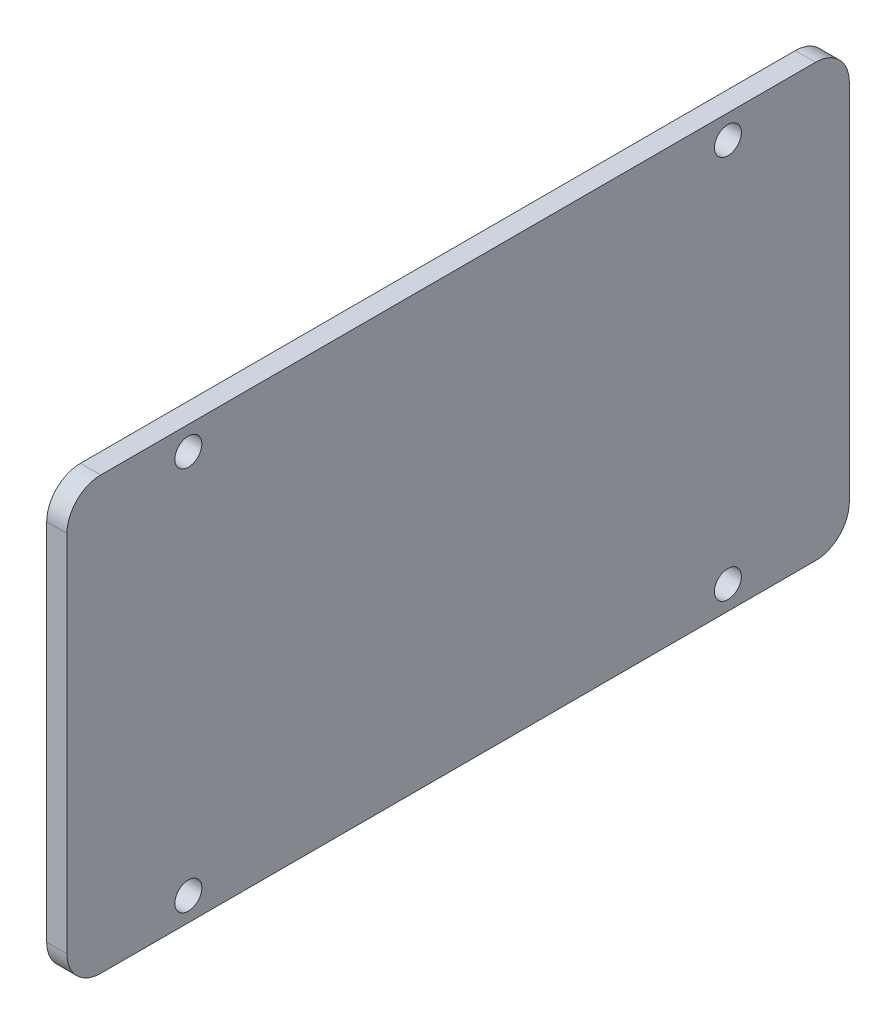
ISO-10303-21;
HEADER;
FILE_DESCRIPTION(('STEP AP214'),'2;1');
FILE_NAME('part.step','',(''),(''),'','','');
FILE_SCHEMA(('AUTOMOTIVE_DESIGN { 1 0 10303 214 1 1 1 1 }'));
ENDSEC;
DATA;
#1=APPLICATION_CONTEXT('core data for automotive mechanical design processes');
#2=APPLICATION_PROTOCOL_DEFINITION('international standard','automotive_design',2000,#1);
#3=PRODUCT_CONTEXT('',#1,'mechanical');
#4=PRODUCT('Part','Part','',(#3));
#5=PRODUCT_RELATED_PRODUCT_CATEGORY('part','',(#4));
#6=PRODUCT_DEFINITION_FORMATION('','',#4);
#7=PRODUCT_DEFINITION_CONTEXT('part definition',#1,'design');
#8=PRODUCT_DEFINITION('design','',#6,#7);
#9=PRODUCT_DEFINITION_SHAPE('','',#8);
#10=(LENGTH_UNIT() NAMED_UNIT(*) SI_UNIT(.MILLI.,.METRE.));
#11=(NAMED_UNIT(*) PLANE_ANGLE_UNIT() SI_UNIT($,.RADIAN.));
#12=(NAMED_UNIT(*) SI_UNIT($,.STERADIAN.) SOLID_ANGLE_UNIT());
#13=UNCERTAINTY_MEASURE_WITH_UNIT(LENGTH_MEASURE(1.E-05),#10,'distance_accuracy_value','');
#14=(GEOMETRIC_REPRESENTATION_CONTEXT(3) GLOBAL_UNCERTAINTY_ASSIGNED_CONTEXT((#13)) GLOBAL_UNIT_ASSIGNED_CONTEXT((#10,
#11,#12)) REPRESENTATION_CONTEXT('',''));
#15=CARTESIAN_POINT('',(0.,0.,0.));
#16=DIRECTION('',(0.,0.,1.));
#17=DIRECTION('',(1.,0.,0.));
#18=AXIS2_PLACEMENT_3D('',#15,#16,#17);
#19=CARTESIAN_POINT('',(3.,0.,116.));
#20=DIRECTION('',(-1.,0.,0.));
#21=DIRECTION('',(0.,0.,1.));
#22=AXIS2_PLACEMENT_3D('',#19,#20,#21);
#23=PLANE('',#22);
#24=CARTESIAN_POINT('',(3.,3.5,18.));
#25=DIRECTION('',(-1.,0.,0.));
#26=DIRECTION('',(0.,0.,1.));
#27=AXIS2_PLACEMENT_3D('',#24,#25,#26);
#28=CIRCLE('',#27,2.);
#29=CARTESIAN_POINT('',(3.,3.5,20.));
#30=VERTEX_POINT('',#29);
#31=EDGE_CURVE('E232',#30,#30,#28,.T.);
#32=ORIENTED_EDGE('',*,*,#31,.T.);
#33=EDGE_LOOP('',(#32));
#34=FACE_BOUND('',#33,.T.);
#35=CARTESIAN_POINT('',(3.,3.5,98.));
#36=DIRECTION('',(-1.,0.,0.));
#37=DIRECTION('',(0.,0.,1.));
#38=AXIS2_PLACEMENT_3D('',#35,#36,#37);
#39=CIRCLE('',#38,2.);
#40=CARTESIAN_POINT('',(3.,3.5,100.));
#41=VERTEX_POINT('',#40);
#42=EDGE_CURVE('E236',#41,#41,#39,.T.);
#43=ORIENTED_EDGE('',*,*,#42,.T.);
#44=EDGE_LOOP('',(#43));
#45=FACE_BOUND('',#44,.T.);
#46=CARTESIAN_POINT('',(3.,60.5,98.));
#47=DIRECTION('',(-1.,0.,0.));
#48=DIRECTION('',(0.,0.,1.));
#49=AXIS2_PLACEMENT_3D('',#46,#47,#48);
#50=CIRCLE('',#49,2.);
#51=CARTESIAN_POINT('',(3.,60.5,100.));
#52=VERTEX_POINT('',#51);
#53=EDGE_CURVE('E245',#52,#52,#50,.T.);
#54=ORIENTED_EDGE('',*,*,#53,.T.);
#55=EDGE_LOOP('',(#54));
#56=FACE_BOUND('',#55,.T.);
#57=CARTESIAN_POINT('',(3.,60.5,18.));
#58=DIRECTION('',(-1.,0.,0.));
#59=DIRECTION('',(0.,0.,1.));
#60=AXIS2_PLACEMENT_3D('',#57,#58,#59);
#61=CIRCLE('',#60,2.);
#62=CARTESIAN_POINT('',(3.,60.5,20.));
#63=VERTEX_POINT('',#62);
#64=EDGE_CURVE('E170',#63,#63,#61,.T.);
#65=ORIENTED_EDGE('',*,*,#64,.T.);
#66=EDGE_LOOP('',(#65));
#67=FACE_BOUND('',#66,.T.);
#68=DIRECTION('',(0.,1.,0.));
#69=VECTOR('',#68,1.);
#70=CARTESIAN_POINT('',(3.,0.,116.));
#71=LINE('',#70,#69);
#72=CARTESIAN_POINT('',(3.,5.,116.));
#73=VERTEX_POINT('',#72);
#74=CARTESIAN_POINT('',(3.,59.,116.));
#75=VERTEX_POINT('',#74);
#76=EDGE_CURVE('E105',#73,#75,#71,.T.);
#77=ORIENTED_EDGE('',*,*,#76,.F.);
#78=CARTESIAN_POINT('',(3.,5.,111.));
#79=DIRECTION('',(-1.,0.,0.));
#80=DIRECTION('',(0.,0.,1.));
#81=AXIS2_PLACEMENT_3D('',#78,#79,#80);
#82=CIRCLE('',#81,5.);
#83=CARTESIAN_POINT('',(3.,0.,111.));
#84=VERTEX_POINT('',#83);
#85=EDGE_CURVE('E100',#73,#84,#82,.F.);
#86=ORIENTED_EDGE('',*,*,#85,.T.);
#87=DIRECTION('',(0.,0.,-1.));
#88=VECTOR('',#87,1.);
#89=CARTESIAN_POINT('',(3.,0.,116.));
#90=LINE('',#89,#88);
#91=CARTESIAN_POINT('',(3.,0.,5.00000000000003));
#92=VERTEX_POINT('',#91);
#93=EDGE_CURVE('E102',#84,#92,#90,.T.);
#94=ORIENTED_EDGE('',*,*,#93,.T.);
#95=CARTESIAN_POINT('',(3.,5.,5.));
#96=DIRECTION('',(-1.,0.,0.));
#97=DIRECTION('',(0.,0.,1.));
#98=AXIS2_PLACEMENT_3D('',#95,#96,#97);
#99=CIRCLE('',#98,5.);
#100=CARTESIAN_POINT('',(3.,5.,0.));
#101=VERTEX_POINT('',#100);
#102=EDGE_CURVE('E110',#92,#101,#99,.F.);
#103=ORIENTED_EDGE('',*,*,#102,.T.);
#104=DIRECTION('',(0.,1.,0.));
#105=VECTOR('',#104,1.);
#106=CARTESIAN_POINT('',(3.,0.,0.));
#107=LINE('',#106,#105);
#108=CARTESIAN_POINT('',(3.,59.,0.));
#109=VERTEX_POINT('',#108);
#110=EDGE_CURVE('E167',#101,#109,#107,.T.);
#111=ORIENTED_EDGE('',*,*,#110,.T.);
#112=CARTESIAN_POINT('',(3.,59.,5.));
#113=DIRECTION('',(-1.,0.,0.));
#114=DIRECTION('',(0.,0.,1.));
#115=AXIS2_PLACEMENT_3D('',#112,#113,#114);
#116=CIRCLE('',#115,5.);
#117=CARTESIAN_POINT('',(3.,64.,5.00000000000003));
#118=VERTEX_POINT('',#117);
#119=EDGE_CURVE('E49',#109,#118,#116,.F.);
#120=ORIENTED_EDGE('',*,*,#119,.T.);
#121=DIRECTION('',(0.,0.,-1.));
#122=VECTOR('',#121,1.);
#123=CARTESIAN_POINT('',(3.,64.,116.));
#124=LINE('',#123,#122);
#125=CARTESIAN_POINT('',(3.,64.,111.));
#126=VERTEX_POINT('',#125);
#127=EDGE_CURVE('E129',#126,#118,#124,.T.);
#128=ORIENTED_EDGE('',*,*,#127,.F.);
#129=CARTESIAN_POINT('',(3.,59.,111.));
#130=DIRECTION('',(-1.,0.,0.));
#131=DIRECTION('',(0.,0.,1.));
#132=AXIS2_PLACEMENT_3D('',#129,#130,#131);
#133=CIRCLE('',#132,5.);
#134=EDGE_CURVE('E57',#126,#75,#133,.F.);
#135=ORIENTED_EDGE('',*,*,#134,.T.);
#136=EDGE_LOOP('',(#77,#86,#94,#103,#111,#120,#128,#135));
#137=FACE_BOUND('',#136,.T.);
#138=ADVANCED_FACE('F34',(#34,#45,#56,#67,#137),#23,.F.);
#139=CARTESIAN_POINT('',(0.,64.,116.));
#140=DIRECTION('',(0.,1.,0.));
#141=DIRECTION('',(0.,0.,1.));
#142=AXIS2_PLACEMENT_3D('',#139,#140,#141);
#143=PLANE('',#142);
#144=DIRECTION('',(0.,0.,-1.));
#145=VECTOR('',#144,1.);
#146=CARTESIAN_POINT('',(0.,64.,116.));
#147=LINE('',#146,#145);
#148=CARTESIAN_POINT('',(0.,64.,111.));
#149=VERTEX_POINT('',#148);
#150=CARTESIAN_POINT('',(0.,64.,5.00000000000003));
#151=VERTEX_POINT('',#150);
#152=EDGE_CURVE('E153',#149,#151,#147,.T.);
#153=ORIENTED_EDGE('',*,*,#152,.F.);
#154=DIRECTION('',(1.,0.,0.));
#155=VECTOR('',#154,1.);
#156=CARTESIAN_POINT('',(3.,64.,111.));
#157=LINE('',#156,#155);
#158=EDGE_CURVE('E11',#149,#126,#157,.T.);
#159=ORIENTED_EDGE('',*,*,#158,.T.);
#160=ORIENTED_EDGE('',*,*,#127,.T.);
#161=DIRECTION('',(1.,0.,0.));
#162=VECTOR('',#161,1.);
#163=CARTESIAN_POINT('',(0.,64.,5.));
#164=LINE('',#163,#162);
#165=EDGE_CURVE('E42',#118,#151,#164,.F.);
#166=ORIENTED_EDGE('',*,*,#165,.T.);
#167=EDGE_LOOP('',(#153,#159,#160,#166));
#168=FACE_BOUND('',#167,.T.);
#169=ADVANCED_FACE('F152',(#168),#143,.T.);
#170=CARTESIAN_POINT('',(0.,0.,116.));
#171=DIRECTION('',(-1.,0.,0.));
#172=DIRECTION('',(0.,0.,1.));
#173=AXIS2_PLACEMENT_3D('',#170,#171,#172);
#174=PLANE('',#173);
#175=CARTESIAN_POINT('',(0.,3.5,18.));
#176=DIRECTION('',(-1.,0.,0.));
#177=DIRECTION('',(0.,0.,-1.));
#178=AXIS2_PLACEMENT_3D('',#175,#176,#177);
#179=CIRCLE('',#178,2.);
#180=CARTESIAN_POINT('',(0.,3.5,16.));
#181=VERTEX_POINT('',#180);
#182=EDGE_CURVE('E230',#181,#181,#179,.T.);
#183=ORIENTED_EDGE('',*,*,#182,.F.);
#184=EDGE_LOOP('',(#183));
#185=FACE_BOUND('',#184,.T.);
#186=CARTESIAN_POINT('',(0.,3.5,98.));
#187=DIRECTION('',(-1.,0.,0.));
#188=DIRECTION('',(0.,0.,1.));
#189=AXIS2_PLACEMENT_3D('',#186,#187,#188);
#190=CIRCLE('',#189,2.);
#191=CARTESIAN_POINT('',(0.,3.5,100.));
#192=VERTEX_POINT('',#191);
#193=EDGE_CURVE('E233',#192,#192,#190,.T.);
#194=ORIENTED_EDGE('',*,*,#193,.F.);
#195=EDGE_LOOP('',(#194));
#196=FACE_BOUND('',#195,.T.);
#197=CARTESIAN_POINT('',(0.,60.5,98.));
#198=DIRECTION('',(-1.,0.,0.));
#199=DIRECTION('',(0.,0.,-1.));
#200=AXIS2_PLACEMENT_3D('',#197,#198,#199);
#201=CIRCLE('',#200,2.);
#202=CARTESIAN_POINT('',(0.,60.5,96.));
#203=VERTEX_POINT('',#202);
#204=EDGE_CURVE('E242',#203,#203,#201,.T.);
#205=ORIENTED_EDGE('',*,*,#204,.F.);
#206=EDGE_LOOP('',(#205));
#207=FACE_BOUND('',#206,.T.);
#208=CARTESIAN_POINT('',(0.,60.5,18.));
#209=DIRECTION('',(-1.,0.,0.));
#210=DIRECTION('',(0.,0.,1.));
#211=AXIS2_PLACEMENT_3D('',#208,#209,#210);
#212=CIRCLE('',#211,2.);
#213=CARTESIAN_POINT('',(0.,60.5,20.));
#214=VERTEX_POINT('',#213);
#215=EDGE_CURVE('E174',#214,#214,#212,.T.);
#216=ORIENTED_EDGE('',*,*,#215,.F.);
#217=EDGE_LOOP('',(#216));
#218=FACE_BOUND('',#217,.T.);
#219=DIRECTION('',(0.,0.,-1.));
#220=VECTOR('',#219,1.);
#221=CARTESIAN_POINT('',(0.,0.,116.));
#222=LINE('',#221,#220);
#223=CARTESIAN_POINT('',(0.,0.,111.));
#224=VERTEX_POINT('',#223);
#225=CARTESIAN_POINT('',(0.,0.,5.00000000000003));
#226=VERTEX_POINT('',#225);
#227=EDGE_CURVE('E120',#224,#226,#222,.T.);
#228=ORIENTED_EDGE('',*,*,#227,.F.);
#229=CARTESIAN_POINT('',(0.,5.,111.));
#230=DIRECTION('',(-1.,0.,0.));
#231=DIRECTION('',(0.,0.,1.));
#232=AXIS2_PLACEMENT_3D('',#229,#230,#231);
#233=CIRCLE('',#232,5.);
#234=CARTESIAN_POINT('',(0.,5.,116.));
#235=VERTEX_POINT('',#234);
#236=EDGE_CURVE('E124',#224,#235,#233,.T.);
#237=ORIENTED_EDGE('',*,*,#236,.T.);
#238=DIRECTION('',(0.,1.,0.));
#239=VECTOR('',#238,1.);
#240=CARTESIAN_POINT('',(0.,0.,116.));
#241=LINE('',#240,#239);
#242=CARTESIAN_POINT('',(0.,59.,116.));
#243=VERTEX_POINT('',#242);
#244=EDGE_CURVE('E121',#235,#243,#241,.T.);
#245=ORIENTED_EDGE('',*,*,#244,.T.);
#246=CARTESIAN_POINT('',(0.,59.,111.));
#247=DIRECTION('',(-1.,0.,0.));
#248=DIRECTION('',(0.,0.,1.));
#249=AXIS2_PLACEMENT_3D('',#246,#247,#248);
#250=CIRCLE('',#249,5.);
#251=EDGE_CURVE('E127',#243,#149,#250,.T.);
#252=ORIENTED_EDGE('',*,*,#251,.T.);
#253=ORIENTED_EDGE('',*,*,#152,.T.);
#254=CARTESIAN_POINT('',(0.,59.,5.));
#255=DIRECTION('',(-1.,0.,0.));
#256=DIRECTION('',(0.,0.,1.));
#257=AXIS2_PLACEMENT_3D('',#254,#255,#256);
#258=CIRCLE('',#257,5.);
#259=CARTESIAN_POINT('',(0.,59.,0.));
#260=VERTEX_POINT('',#259);
#261=EDGE_CURVE('E125',#151,#260,#258,.T.);
#262=ORIENTED_EDGE('',*,*,#261,.T.);
#263=DIRECTION('',(0.,1.,0.));
#264=VECTOR('',#263,1.);
#265=CARTESIAN_POINT('',(0.,0.,0.));
#266=LINE('',#265,#264);
#267=CARTESIAN_POINT('',(0.,5.,0.));
#268=VERTEX_POINT('',#267);
#269=EDGE_CURVE('E169',#268,#260,#266,.T.);
#270=ORIENTED_EDGE('',*,*,#269,.F.);
#271=CARTESIAN_POINT('',(0.,5.,5.));
#272=DIRECTION('',(-1.,0.,0.));
#273=DIRECTION('',(0.,0.,1.));
#274=AXIS2_PLACEMENT_3D('',#271,#272,#273);
#275=CIRCLE('',#274,5.);
#276=EDGE_CURVE('E134',#268,#226,#275,.T.);
#277=ORIENTED_EDGE('',*,*,#276,.T.);
#278=EDGE_LOOP('',(#228,#237,#245,#252,#253,#262,#270,#277));
#279=FACE_BOUND('',#278,.T.);
#280=ADVANCED_FACE('F157',(#185,#196,#207,#218,#279),#174,.T.);
#281=CARTESIAN_POINT('',(3.,0.,116.));
#282=DIRECTION('',(0.,-1.,0.));
#283=DIRECTION('',(0.,0.,-1.));
#284=AXIS2_PLACEMENT_3D('',#281,#282,#283);
#285=PLANE('',#284);
#286=ORIENTED_EDGE('',*,*,#93,.F.);
#287=DIRECTION('',(-1.,0.,0.));
#288=VECTOR('',#287,1.);
#289=CARTESIAN_POINT('',(0.,0.,111.));
#290=LINE('',#289,#288);
#291=EDGE_CURVE('E116',#84,#224,#290,.T.);
#292=ORIENTED_EDGE('',*,*,#291,.T.);
#293=ORIENTED_EDGE('',*,*,#227,.T.);
#294=DIRECTION('',(-1.,0.,0.));
#295=VECTOR('',#294,1.);
#296=CARTESIAN_POINT('',(3.,0.,5.));
#297=LINE('',#296,#295);
#298=EDGE_CURVE('E119',#226,#92,#297,.F.);
#299=ORIENTED_EDGE('',*,*,#298,.T.);
#300=EDGE_LOOP('',(#286,#292,#293,#299));
#301=FACE_BOUND('',#300,.T.);
#302=ADVANCED_FACE('F114',(#301),#285,.T.);
#303=CARTESIAN_POINT('',(3.,64.,116.));
#304=DIRECTION('',(0.,0.,-1.));
#305=DIRECTION('',(-1.,0.,0.));
#306=AXIS2_PLACEMENT_3D('',#303,#304,#305);
#307=PLANE('',#306);
#308=ORIENTED_EDGE('',*,*,#244,.F.);
#309=DIRECTION('',(-1.,0.,0.));
#310=VECTOR('',#309,1.);
#311=CARTESIAN_POINT('',(3.,5.,116.));
#312=LINE('',#311,#310);
#313=EDGE_CURVE('E139',#235,#73,#312,.F.);
#314=ORIENTED_EDGE('',*,*,#313,.T.);
#315=ORIENTED_EDGE('',*,*,#76,.T.);
#316=DIRECTION('',(1.,0.,0.));
#317=VECTOR('',#316,1.);
#318=CARTESIAN_POINT('',(0.,59.,116.));
#319=LINE('',#318,#317);
#320=EDGE_CURVE('E137',#75,#243,#319,.F.);
#321=ORIENTED_EDGE('',*,*,#320,.T.);
#322=EDGE_LOOP('',(#308,#314,#315,#321));
#323=FACE_BOUND('',#322,.T.);
#324=ADVANCED_FACE('F205',(#323),#307,.F.);
#325=CARTESIAN_POINT('',(3.,64.,0.));
#326=DIRECTION('',(0.,0.,-1.));
#327=DIRECTION('',(-1.,0.,0.));
#328=AXIS2_PLACEMENT_3D('',#325,#326,#327);
#329=PLANE('',#328);
#330=ORIENTED_EDGE('',*,*,#110,.F.);
#331=DIRECTION('',(-1.,0.,0.));
#332=VECTOR('',#331,1.);
#333=CARTESIAN_POINT('',(3.,5.,0.));
#334=LINE('',#333,#332);
#335=EDGE_CURVE('E146',#101,#268,#334,.T.);
#336=ORIENTED_EDGE('',*,*,#335,.T.);
#337=ORIENTED_EDGE('',*,*,#269,.T.);
#338=DIRECTION('',(1.,0.,0.));
#339=VECTOR('',#338,1.);
#340=CARTESIAN_POINT('',(3.,59.,0.));
#341=LINE('',#340,#339);
#342=EDGE_CURVE('E109',#260,#109,#341,.T.);
#343=ORIENTED_EDGE('',*,*,#342,.T.);
#344=EDGE_LOOP('',(#330,#336,#337,#343));
#345=FACE_BOUND('',#344,.T.);
#346=ADVANCED_FACE('F166',(#345),#329,.T.);
#347=CARTESIAN_POINT('',(10.,60.5,18.));
#348=DIRECTION('',(-1.,0.,0.));
#349=DIRECTION('',(0.,0.,1.));
#350=AXIS2_PLACEMENT_3D('',#347,#348,#349);
#351=CYLINDRICAL_SURFACE('',#350,2.);
#352=ORIENTED_EDGE('',*,*,#215,.T.);
#353=EDGE_LOOP('',(#352));
#354=FACE_BOUND('',#353,.T.);
#355=ORIENTED_EDGE('',*,*,#64,.F.);
#356=EDGE_LOOP('',(#355));
#357=FACE_BOUND('',#356,.T.);
#358=ADVANCED_FACE('F208',(#354,#357),#351,.F.);
#359=CARTESIAN_POINT('',(10.,60.5,98.));
#360=DIRECTION('',(-1.,0.,0.));
#361=DIRECTION('',(0.,0.,1.));
#362=AXIS2_PLACEMENT_3D('',#359,#360,#361);
#363=CYLINDRICAL_SURFACE('',#362,2.);
#364=ORIENTED_EDGE('',*,*,#204,.T.);
#365=EDGE_LOOP('',(#364));
#366=FACE_BOUND('',#365,.T.);
#367=ORIENTED_EDGE('',*,*,#53,.F.);
#368=EDGE_LOOP('',(#367));
#369=FACE_BOUND('',#368,.T.);
#370=ADVANCED_FACE('F214',(#366,#369),#363,.F.);
#371=CARTESIAN_POINT('',(10.,3.5,98.));
#372=DIRECTION('',(-1.,0.,0.));
#373=DIRECTION('',(0.,0.,1.));
#374=AXIS2_PLACEMENT_3D('',#371,#372,#373);
#375=CYLINDRICAL_SURFACE('',#374,2.);
#376=ORIENTED_EDGE('',*,*,#193,.T.);
#377=EDGE_LOOP('',(#376));
#378=FACE_BOUND('',#377,.T.);
#379=ORIENTED_EDGE('',*,*,#42,.F.);
#380=EDGE_LOOP('',(#379));
#381=FACE_BOUND('',#380,.T.);
#382=ADVANCED_FACE('F218',(#378,#381),#375,.F.);
#383=CARTESIAN_POINT('',(10.,3.5,18.));
#384=DIRECTION('',(-1.,0.,0.));
#385=DIRECTION('',(0.,0.,1.));
#386=AXIS2_PLACEMENT_3D('',#383,#384,#385);
#387=CYLINDRICAL_SURFACE('',#386,2.);
#388=ORIENTED_EDGE('',*,*,#182,.T.);
#389=EDGE_LOOP('',(#388));
#390=FACE_BOUND('',#389,.T.);
#391=ORIENTED_EDGE('',*,*,#31,.F.);
#392=EDGE_LOOP('',(#391));
#393=FACE_BOUND('',#392,.T.);
#394=ADVANCED_FACE('F188',(#390,#393),#387,.F.);
#395=CARTESIAN_POINT('',(3.,5.,111.));
#396=DIRECTION('',(1.,0.,0.));
#397=DIRECTION('',(0.,0.,-1.));
#398=AXIS2_PLACEMENT_3D('',#395,#396,#397);
#399=CYLINDRICAL_SURFACE('',#398,5.);
#400=ORIENTED_EDGE('',*,*,#85,.F.);
#401=ORIENTED_EDGE('',*,*,#313,.F.);
#402=ORIENTED_EDGE('',*,*,#236,.F.);
#403=ORIENTED_EDGE('',*,*,#291,.F.);
#404=EDGE_LOOP('',(#400,#401,#402,#403));
#405=FACE_BOUND('',#404,.T.);
#406=ADVANCED_FACE('F123',(#405),#399,.T.);
#407=CARTESIAN_POINT('',(3.,5.,5.));
#408=DIRECTION('',(-1.,0.,0.));
#409=DIRECTION('',(0.,0.,1.));
#410=AXIS2_PLACEMENT_3D('',#407,#408,#409);
#411=CYLINDRICAL_SURFACE('',#410,5.);
#412=ORIENTED_EDGE('',*,*,#102,.F.);
#413=ORIENTED_EDGE('',*,*,#298,.F.);
#414=ORIENTED_EDGE('',*,*,#276,.F.);
#415=ORIENTED_EDGE('',*,*,#335,.F.);
#416=EDGE_LOOP('',(#412,#413,#414,#415));
#417=FACE_BOUND('',#416,.T.);
#418=ADVANCED_FACE('F180',(#417),#411,.T.);
#419=CARTESIAN_POINT('',(0.,59.,111.));
#420=DIRECTION('',(-1.,0.,0.));
#421=DIRECTION('',(0.,0.,1.));
#422=AXIS2_PLACEMENT_3D('',#419,#420,#421);
#423=CYLINDRICAL_SURFACE('',#422,5.);
#424=ORIENTED_EDGE('',*,*,#251,.F.);
#425=ORIENTED_EDGE('',*,*,#320,.F.);
#426=ORIENTED_EDGE('',*,*,#134,.F.);
#427=ORIENTED_EDGE('',*,*,#158,.F.);
#428=EDGE_LOOP('',(#424,#425,#426,#427));
#429=FACE_BOUND('',#428,.T.);
#430=ADVANCED_FACE('F182',(#429),#423,.T.);
#431=CARTESIAN_POINT('',(3.,59.,5.));
#432=DIRECTION('',(1.,0.,0.));
#433=DIRECTION('',(0.,0.,-1.));
#434=AXIS2_PLACEMENT_3D('',#431,#432,#433);
#435=CYLINDRICAL_SURFACE('',#434,5.);
#436=ORIENTED_EDGE('',*,*,#261,.F.);
#437=ORIENTED_EDGE('',*,*,#165,.F.);
#438=ORIENTED_EDGE('',*,*,#119,.F.);
#439=ORIENTED_EDGE('',*,*,#342,.F.);
#440=EDGE_LOOP('',(#436,#437,#438,#439));
#441=FACE_BOUND('',#440,.T.);
#442=ADVANCED_FACE('F36',(#441),#435,.T.);
#443=CLOSED_SHELL('',(#138,#169,#280,#302,#324,#346,#358,#370,#382,#394,#406,#418,#430,#442));
#444=MANIFOLD_SOLID_BREP('B2',#443);
#445=ADVANCED_BREP_SHAPE_REPRESENTATION('',(#18,#444),#14);
#446=SHAPE_DEFINITION_REPRESENTATION(#9,#445);
ENDSEC;
END-ISO-10303-21;
